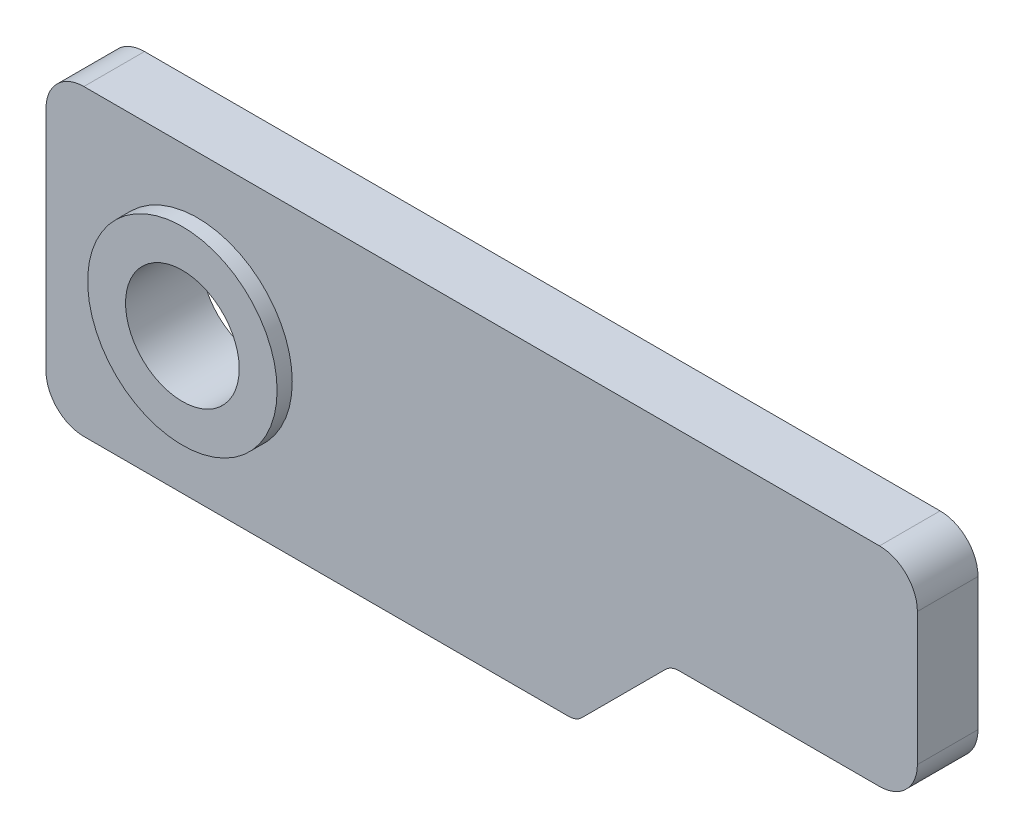
ISO-10303-21;
HEADER;
FILE_DESCRIPTION(('STEP AP214'),'2;1');
FILE_NAME('part.step','',(''),(''),'','','');
FILE_SCHEMA(('AUTOMOTIVE_DESIGN { 1 0 10303 214 1 1 1 1 }'));
ENDSEC;
DATA;
#1=APPLICATION_CONTEXT('core data for automotive mechanical design processes');
#2=APPLICATION_PROTOCOL_DEFINITION('international standard','automotive_design',2000,#1);
#3=PRODUCT_CONTEXT('',#1,'mechanical');
#4=PRODUCT('Part','Part','',(#3));
#5=PRODUCT_RELATED_PRODUCT_CATEGORY('part','',(#4));
#6=PRODUCT_DEFINITION_FORMATION('','',#4);
#7=PRODUCT_DEFINITION_CONTEXT('part definition',#1,'design');
#8=PRODUCT_DEFINITION('design','',#6,#7);
#9=PRODUCT_DEFINITION_SHAPE('','',#8);
#10=(LENGTH_UNIT() NAMED_UNIT(*) SI_UNIT(.MILLI.,.METRE.));
#11=(NAMED_UNIT(*) PLANE_ANGLE_UNIT() SI_UNIT($,.RADIAN.));
#12=(NAMED_UNIT(*) SI_UNIT($,.STERADIAN.) SOLID_ANGLE_UNIT());
#13=UNCERTAINTY_MEASURE_WITH_UNIT(LENGTH_MEASURE(1.E-05),#10,'distance_accuracy_value','');
#14=(GEOMETRIC_REPRESENTATION_CONTEXT(3) GLOBAL_UNCERTAINTY_ASSIGNED_CONTEXT((#13)) GLOBAL_UNIT_ASSIGNED_CONTEXT((#10,
#11,#12)) REPRESENTATION_CONTEXT('',''));
#15=CARTESIAN_POINT('',(0.,0.,0.));
#16=DIRECTION('',(0.,0.,1.));
#17=DIRECTION('',(1.,0.,0.));
#18=AXIS2_PLACEMENT_3D('',#15,#16,#17);
#19=CARTESIAN_POINT('',(12.7071067811865,-2.,0.));
#20=DIRECTION('',(0.,0.,-1.));
#21=DIRECTION('',(-0.382683432365089,0.923879532511287,0.));
#22=AXIS2_PLACEMENT_3D('',#19,#20,#21);
#23=CYLINDRICAL_SURFACE('',#22,0.5);
#24=CARTESIAN_POINT('',(12.7071067811865,-2.,0.));
#25=DIRECTION('',(0.,0.,-1.));
#26=DIRECTION('',(-0.382683432365089,0.923879532511287,0.));
#27=AXIS2_PLACEMENT_3D('',#24,#25,#26);
#28=CIRCLE('',#27,0.5);
#29=CARTESIAN_POINT('',(12.3535533905933,-1.64644660940672,0.));
#30=VERTEX_POINT('',#29);
#31=CARTESIAN_POINT('',(12.7071067811865,-1.5,0.));
#32=VERTEX_POINT('',#31);
#33=EDGE_CURVE('E11',#30,#32,#28,.T.);
#34=ORIENTED_EDGE('',*,*,#33,.T.);
#35=DIRECTION('',(0.,0.,1.));
#36=VECTOR('',#35,1.);
#37=CARTESIAN_POINT('',(12.7071067811865,-1.5,0.));
#38=LINE('',#37,#36);
#39=CARTESIAN_POINT('',(12.7071067811865,-1.5,1.6));
#40=VERTEX_POINT('',#39);
#41=EDGE_CURVE('E27',#32,#40,#38,.T.);
#42=ORIENTED_EDGE('',*,*,#41,.T.);
#43=CARTESIAN_POINT('',(12.7071067811865,-2.,1.6));
#44=DIRECTION('',(0.,0.,1.));
#45=DIRECTION('',(-0.382683432365089,0.923879532511287,0.));
#46=AXIS2_PLACEMENT_3D('',#43,#44,#45);
#47=CIRCLE('',#46,0.5);
#48=CARTESIAN_POINT('',(12.3535533905933,-1.64644660940672,1.6));
#49=VERTEX_POINT('',#48);
#50=EDGE_CURVE('E215',#40,#49,#47,.T.);
#51=ORIENTED_EDGE('',*,*,#50,.T.);
#52=DIRECTION('',(0.,0.,-1.));
#53=VECTOR('',#52,1.);
#54=CARTESIAN_POINT('',(12.3535533905933,-1.64644660940672,0.));
#55=LINE('',#54,#53);
#56=EDGE_CURVE('E208',#49,#30,#55,.T.);
#57=ORIENTED_EDGE('',*,*,#56,.T.);
#58=EDGE_LOOP('',(#34,#42,#51,#57));
#59=FACE_BOUND('',#58,.T.);
#60=ADVANCED_FACE('F17',(#59),#23,.F.);
#61=CARTESIAN_POINT('',(12.5,-1.5,0.));
#62=DIRECTION('',(0.,-1.,0.));
#63=DIRECTION('',(0.707106781186548,0.,0.707106781186548));
#64=AXIS2_PLACEMENT_3D('',#61,#62,#63);
#65=PLANE('',#64);
#66=ORIENTED_EDGE('',*,*,#41,.F.);
#67=DIRECTION('',(-1.,0.,0.));
#68=VECTOR('',#67,1.);
#69=CARTESIAN_POINT('',(19.,-1.5,0.));
#70=LINE('',#69,#68);
#71=CARTESIAN_POINT('',(18.,-1.5,0.));
#72=VERTEX_POINT('',#71);
#73=EDGE_CURVE('E181',#72,#32,#70,.T.);
#74=ORIENTED_EDGE('',*,*,#73,.F.);
#75=DIRECTION('',(0.,0.,-1.));
#76=VECTOR('',#75,1.);
#77=CARTESIAN_POINT('',(18.,-1.5,0.));
#78=LINE('',#77,#76);
#79=CARTESIAN_POINT('',(18.,-1.5,1.6));
#80=VERTEX_POINT('',#79);
#81=EDGE_CURVE('E157',#80,#72,#78,.T.);
#82=ORIENTED_EDGE('',*,*,#81,.F.);
#83=DIRECTION('',(1.,0.,0.));
#84=VECTOR('',#83,1.);
#85=CARTESIAN_POINT('',(19.,-1.5,1.6));
#86=LINE('',#85,#84);
#87=EDGE_CURVE('E163',#40,#80,#86,.T.);
#88=ORIENTED_EDGE('',*,*,#87,.F.);
#89=EDGE_LOOP('',(#66,#74,#82,#88));
#90=FACE_BOUND('',#89,.T.);
#91=ADVANCED_FACE('F221',(#90),#65,.T.);
#92=CARTESIAN_POINT('',(9.79289321881345,-3.5,0.));
#93=DIRECTION('',(0.,0.,1.));
#94=DIRECTION('',(0.382683432365092,-0.923879532511286,0.));
#95=AXIS2_PLACEMENT_3D('',#92,#93,#94);
#96=CYLINDRICAL_SURFACE('',#95,0.5);
#97=CARTESIAN_POINT('',(9.79289321881345,-3.5,1.6));
#98=DIRECTION('',(0.,0.,-1.));
#99=DIRECTION('',(0.382683432365092,-0.923879532511286,0.));
#100=AXIS2_PLACEMENT_3D('',#97,#98,#99);
#101=CIRCLE('',#100,0.5);
#102=CARTESIAN_POINT('',(10.1464466094067,-3.85355339059328,1.6));
#103=VERTEX_POINT('',#102);
#104=CARTESIAN_POINT('',(9.79289321881345,-4.,1.6));
#105=VERTEX_POINT('',#104);
#106=EDGE_CURVE('E205',#103,#105,#101,.T.);
#107=ORIENTED_EDGE('',*,*,#106,.T.);
#108=DIRECTION('',(0.,0.,-1.));
#109=VECTOR('',#108,1.);
#110=CARTESIAN_POINT('',(9.79289321881345,-4.,0.));
#111=LINE('',#110,#109);
#112=CARTESIAN_POINT('',(9.79289321881345,-4.,0.));
#113=VERTEX_POINT('',#112);
#114=EDGE_CURVE('E202',#105,#113,#111,.T.);
#115=ORIENTED_EDGE('',*,*,#114,.T.);
#116=CARTESIAN_POINT('',(9.79289321881345,-3.5,0.));
#117=DIRECTION('',(0.,0.,1.));
#118=DIRECTION('',(0.382683432365092,-0.923879532511286,0.));
#119=AXIS2_PLACEMENT_3D('',#116,#117,#118);
#120=CIRCLE('',#119,0.5);
#121=CARTESIAN_POINT('',(10.1464466094067,-3.85355339059328,0.));
#122=VERTEX_POINT('',#121);
#123=EDGE_CURVE('E199',#113,#122,#120,.T.);
#124=ORIENTED_EDGE('',*,*,#123,.T.);
#125=DIRECTION('',(0.,0.,1.));
#126=VECTOR('',#125,1.);
#127=CARTESIAN_POINT('',(10.1464466094067,-3.85355339059328,0.));
#128=LINE('',#127,#126);
#129=EDGE_CURVE('E193',#122,#103,#128,.T.);
#130=ORIENTED_EDGE('',*,*,#129,.T.);
#131=EDGE_LOOP('',(#107,#115,#124,#130));
#132=FACE_BOUND('',#131,.T.);
#133=ADVANCED_FACE('F265',(#132),#96,.T.);
#134=CARTESIAN_POINT('',(10.,-4.,0.));
#135=DIRECTION('',(0.707106781186547,-0.707106781186548,0.));
#136=DIRECTION('',(0.577350269189626,0.577350269189626,0.577350269189626));
#137=AXIS2_PLACEMENT_3D('',#134,#135,#136);
#138=PLANE('',#137);
#139=ORIENTED_EDGE('',*,*,#56,.F.);
#140=DIRECTION('',(0.707106781186548,0.707106781186547,0.));
#141=VECTOR('',#140,1.);
#142=CARTESIAN_POINT('',(12.5,-1.5,1.6));
#143=LINE('',#142,#141);
#144=EDGE_CURVE('E126',#103,#49,#143,.T.);
#145=ORIENTED_EDGE('',*,*,#144,.F.);
#146=ORIENTED_EDGE('',*,*,#129,.F.);
#147=DIRECTION('',(-0.707106781186548,-0.707106781186547,0.));
#148=VECTOR('',#147,1.);
#149=CARTESIAN_POINT('',(12.5,-1.5,0.));
#150=LINE('',#149,#148);
#151=EDGE_CURVE('E175',#30,#122,#150,.T.);
#152=ORIENTED_EDGE('',*,*,#151,.F.);
#153=EDGE_LOOP('',(#139,#145,#146,#152));
#154=FACE_BOUND('',#153,.T.);
#155=ADVANCED_FACE('F228',(#154),#138,.T.);
#156=CARTESIAN_POINT('',(7.08922064036978,0.386587517259701,0.));
#157=DIRECTION('',(0.,0.,1.));
#158=DIRECTION('',(0.707106781186548,0.707106781186548,0.));
#159=AXIS2_PLACEMENT_3D('',#156,#157,#158);
#160=PLANE('',#159);
#161=ORIENTED_EDGE('',*,*,#123,.F.);
#162=DIRECTION('',(-1.,0.,0.));
#163=VECTOR('',#162,1.);
#164=CARTESIAN_POINT('',(10.,-4.,0.));
#165=LINE('',#164,#163);
#166=CARTESIAN_POINT('',(-3.,-4.,0.));
#167=VERTEX_POINT('',#166);
#168=EDGE_CURVE('E189',#113,#167,#165,.T.);
#169=ORIENTED_EDGE('',*,*,#168,.T.);
#170=CARTESIAN_POINT('',(-3.,-3.,0.));
#171=DIRECTION('',(0.,0.,1.));
#172=DIRECTION('',(-0.707106781186548,-0.707106781186548,0.));
#173=AXIS2_PLACEMENT_3D('',#170,#171,#172);
#174=CIRCLE('',#173,1.);
#175=CARTESIAN_POINT('',(-4.,-3.,0.));
#176=VERTEX_POINT('',#175);
#177=EDGE_CURVE('E145',#176,#167,#174,.T.);
#178=ORIENTED_EDGE('',*,*,#177,.F.);
#179=DIRECTION('',(0.,1.,0.));
#180=VECTOR('',#179,1.);
#181=CARTESIAN_POINT('',(-4.,-4.,0.));
#182=LINE('',#181,#180);
#183=CARTESIAN_POINT('',(-4.,3.,0.));
#184=VERTEX_POINT('',#183);
#185=EDGE_CURVE('E185',#176,#184,#182,.T.);
#186=ORIENTED_EDGE('',*,*,#185,.T.);
#187=CARTESIAN_POINT('',(-3.,3.,0.));
#188=DIRECTION('',(0.,0.,1.));
#189=DIRECTION('',(-0.707106781186548,0.707106781186547,0.));
#190=AXIS2_PLACEMENT_3D('',#187,#188,#189);
#191=CIRCLE('',#190,1.);
#192=CARTESIAN_POINT('',(-3.,4.,0.));
#193=VERTEX_POINT('',#192);
#194=EDGE_CURVE('E123',#193,#184,#191,.T.);
#195=ORIENTED_EDGE('',*,*,#194,.F.);
#196=DIRECTION('',(1.,0.,0.));
#197=VECTOR('',#196,1.);
#198=CARTESIAN_POINT('',(-4.,4.,0.));
#199=LINE('',#198,#197);
#200=CARTESIAN_POINT('',(18.,4.,0.));
#201=VERTEX_POINT('',#200);
#202=EDGE_CURVE('E180',#193,#201,#199,.T.);
#203=ORIENTED_EDGE('',*,*,#202,.T.);
#204=CARTESIAN_POINT('',(18.,3.,0.));
#205=DIRECTION('',(0.,0.,1.));
#206=DIRECTION('',(0.707106781186549,0.707106781186547,0.));
#207=AXIS2_PLACEMENT_3D('',#204,#205,#206);
#208=CIRCLE('',#207,1.);
#209=CARTESIAN_POINT('',(19.,3.,0.));
#210=VERTEX_POINT('',#209);
#211=EDGE_CURVE('E165',#210,#201,#208,.T.);
#212=ORIENTED_EDGE('',*,*,#211,.F.);
#213=DIRECTION('',(0.,-1.,0.));
#214=VECTOR('',#213,1.);
#215=CARTESIAN_POINT('',(19.,4.,0.));
#216=LINE('',#215,#214);
#217=CARTESIAN_POINT('',(19.,-0.5,0.));
#218=VERTEX_POINT('',#217);
#219=EDGE_CURVE('E177',#210,#218,#216,.T.);
#220=ORIENTED_EDGE('',*,*,#219,.T.);
#221=CARTESIAN_POINT('',(18.,-0.5,0.));
#222=DIRECTION('',(0.,0.,1.));
#223=DIRECTION('',(0.707106781186548,-0.707106781186547,0.));
#224=AXIS2_PLACEMENT_3D('',#221,#222,#223);
#225=CIRCLE('',#224,1.);
#226=EDGE_CURVE('E160',#72,#218,#225,.T.);
#227=ORIENTED_EDGE('',*,*,#226,.F.);
#228=ORIENTED_EDGE('',*,*,#73,.T.);
#229=ORIENTED_EDGE('',*,*,#33,.F.);
#230=ORIENTED_EDGE('',*,*,#151,.T.);
#231=EDGE_LOOP('',(#161,#169,#178,#186,#195,#203,#212,#220,#227,#228,#229,#230));
#232=FACE_BOUND('',#231,.T.);
#233=CARTESIAN_POINT('',(0.,0.,0.));
#234=DIRECTION('',(0.,0.,1.));
#235=DIRECTION('',(-1.,0.,0.));
#236=AXIS2_PLACEMENT_3D('',#233,#234,#235);
#237=CIRCLE('',#236,1.5);
#238=CARTESIAN_POINT('',(1.5,0.,0.));
#239=VERTEX_POINT('',#238);
#240=EDGE_CURVE('E172',#239,#239,#237,.T.);
#241=ORIENTED_EDGE('',*,*,#240,.T.);
#242=EDGE_LOOP('',(#241));
#243=FACE_BOUND('',#242,.T.);
#244=ADVANCED_FACE('F231',(#232,#243),#160,.F.);
#245=CARTESIAN_POINT('',(18.,3.,0.));
#246=DIRECTION('',(0.,0.,1.));
#247=DIRECTION('',(0.707106781186549,0.707106781186547,0.));
#248=AXIS2_PLACEMENT_3D('',#245,#246,#247);
#249=CYLINDRICAL_SURFACE('',#248,1.);
#250=CARTESIAN_POINT('',(18.,3.,1.6));
#251=DIRECTION('',(0.,0.,-1.));
#252=DIRECTION('',(0.707106781186549,0.707106781186547,0.));
#253=AXIS2_PLACEMENT_3D('',#250,#251,#252);
#254=CIRCLE('',#253,1.);
#255=CARTESIAN_POINT('',(18.,4.,1.6));
#256=VERTEX_POINT('',#255);
#257=CARTESIAN_POINT('',(19.,3.,1.6));
#258=VERTEX_POINT('',#257);
#259=EDGE_CURVE('E169',#256,#258,#254,.T.);
#260=ORIENTED_EDGE('',*,*,#259,.T.);
#261=DIRECTION('',(0.,0.,-1.));
#262=VECTOR('',#261,1.);
#263=CARTESIAN_POINT('',(19.,3.,0.));
#264=LINE('',#263,#262);
#265=EDGE_CURVE('E166',#258,#210,#264,.T.);
#266=ORIENTED_EDGE('',*,*,#265,.T.);
#267=ORIENTED_EDGE('',*,*,#211,.T.);
#268=DIRECTION('',(0.,0.,1.));
#269=VECTOR('',#268,1.);
#270=CARTESIAN_POINT('',(18.,4.,0.));
#271=LINE('',#270,#269);
#272=EDGE_CURVE('E156',#201,#256,#271,.T.);
#273=ORIENTED_EDGE('',*,*,#272,.T.);
#274=EDGE_LOOP('',(#260,#266,#267,#273));
#275=FACE_BOUND('',#274,.T.);
#276=ADVANCED_FACE('F266',(#275),#249,.T.);
#277=CARTESIAN_POINT('',(19.,-1.5,0.));
#278=DIRECTION('',(1.,0.,0.));
#279=DIRECTION('',(0.,0.707106781186548,0.707106781186548));
#280=AXIS2_PLACEMENT_3D('',#277,#278,#279);
#281=PLANE('',#280);
#282=ORIENTED_EDGE('',*,*,#265,.F.);
#283=DIRECTION('',(0.,1.,0.));
#284=VECTOR('',#283,1.);
#285=CARTESIAN_POINT('',(19.,4.,1.6));
#286=LINE('',#285,#284);
#287=CARTESIAN_POINT('',(19.,-0.5,1.6));
#288=VERTEX_POINT('',#287);
#289=EDGE_CURVE('E133',#288,#258,#286,.T.);
#290=ORIENTED_EDGE('',*,*,#289,.F.);
#291=DIRECTION('',(0.,0.,1.));
#292=VECTOR('',#291,1.);
#293=CARTESIAN_POINT('',(19.,-0.5,0.));
#294=LINE('',#293,#292);
#295=EDGE_CURVE('E152',#218,#288,#294,.T.);
#296=ORIENTED_EDGE('',*,*,#295,.F.);
#297=ORIENTED_EDGE('',*,*,#219,.F.);
#298=EDGE_LOOP('',(#282,#290,#296,#297));
#299=FACE_BOUND('',#298,.T.);
#300=ADVANCED_FACE('F239',(#299),#281,.T.);
#301=CARTESIAN_POINT('',(18.,-0.5,0.));
#302=DIRECTION('',(0.,0.,1.));
#303=DIRECTION('',(0.707106781186548,-0.707106781186547,0.));
#304=AXIS2_PLACEMENT_3D('',#301,#302,#303);
#305=CYLINDRICAL_SURFACE('',#304,1.);
#306=CARTESIAN_POINT('',(18.,-0.5,1.6));
#307=DIRECTION('',(0.,0.,-1.));
#308=DIRECTION('',(0.707106781186548,-0.707106781186547,0.));
#309=AXIS2_PLACEMENT_3D('',#306,#307,#308);
#310=CIRCLE('',#309,1.);
#311=EDGE_CURVE('E153',#288,#80,#310,.T.);
#312=ORIENTED_EDGE('',*,*,#311,.T.);
#313=ORIENTED_EDGE('',*,*,#81,.T.);
#314=ORIENTED_EDGE('',*,*,#226,.T.);
#315=ORIENTED_EDGE('',*,*,#295,.T.);
#316=EDGE_LOOP('',(#312,#313,#314,#315));
#317=FACE_BOUND('',#316,.T.);
#318=ADVANCED_FACE('F237',(#317),#305,.T.);
#319=CARTESIAN_POINT('',(-3.,-3.,0.));
#320=DIRECTION('',(0.,0.,1.));
#321=DIRECTION('',(-0.707106781186548,-0.707106781186548,0.));
#322=AXIS2_PLACEMENT_3D('',#319,#320,#321);
#323=CYLINDRICAL_SURFACE('',#322,1.);
#324=CARTESIAN_POINT('',(-3.,-3.,1.6));
#325=DIRECTION('',(0.,0.,-1.));
#326=DIRECTION('',(-0.707106781186548,-0.707106781186548,0.));
#327=AXIS2_PLACEMENT_3D('',#324,#325,#326);
#328=CIRCLE('',#327,1.);
#329=CARTESIAN_POINT('',(-3.,-4.,1.6));
#330=VERTEX_POINT('',#329);
#331=CARTESIAN_POINT('',(-4.,-3.,1.6));
#332=VERTEX_POINT('',#331);
#333=EDGE_CURVE('E149',#330,#332,#328,.T.);
#334=ORIENTED_EDGE('',*,*,#333,.T.);
#335=DIRECTION('',(0.,0.,-1.));
#336=VECTOR('',#335,1.);
#337=CARTESIAN_POINT('',(-4.,-3.,0.));
#338=LINE('',#337,#336);
#339=EDGE_CURVE('E146',#332,#176,#338,.T.);
#340=ORIENTED_EDGE('',*,*,#339,.T.);
#341=ORIENTED_EDGE('',*,*,#177,.T.);
#342=DIRECTION('',(0.,0.,1.));
#343=VECTOR('',#342,1.);
#344=CARTESIAN_POINT('',(-3.,-4.,0.));
#345=LINE('',#344,#343);
#346=EDGE_CURVE('E141',#167,#330,#345,.T.);
#347=ORIENTED_EDGE('',*,*,#346,.T.);
#348=EDGE_LOOP('',(#334,#340,#341,#347));
#349=FACE_BOUND('',#348,.T.);
#350=ADVANCED_FACE('F258',(#349),#323,.T.);
#351=CARTESIAN_POINT('',(-4.,-4.,0.));
#352=DIRECTION('',(0.,-1.,0.));
#353=DIRECTION('',(0.707106781186548,0.,0.707106781186548));
#354=AXIS2_PLACEMENT_3D('',#351,#352,#353);
#355=PLANE('',#354);
#356=ORIENTED_EDGE('',*,*,#114,.F.);
#357=DIRECTION('',(1.,0.,0.));
#358=VECTOR('',#357,1.);
#359=CARTESIAN_POINT('',(10.,-4.,1.6));
#360=LINE('',#359,#358);
#361=EDGE_CURVE('E129',#330,#105,#360,.T.);
#362=ORIENTED_EDGE('',*,*,#361,.F.);
#363=ORIENTED_EDGE('',*,*,#346,.F.);
#364=ORIENTED_EDGE('',*,*,#168,.F.);
#365=EDGE_LOOP('',(#356,#362,#363,#364));
#366=FACE_BOUND('',#365,.T.);
#367=ADVANCED_FACE('F262',(#366),#355,.T.);
#368=CARTESIAN_POINT('',(-3.,3.,0.));
#369=DIRECTION('',(0.,0.,1.));
#370=DIRECTION('',(-0.707106781186548,0.707106781186547,0.));
#371=AXIS2_PLACEMENT_3D('',#368,#369,#370);
#372=CYLINDRICAL_SURFACE('',#371,1.);
#373=CARTESIAN_POINT('',(-3.,3.,1.6));
#374=DIRECTION('',(0.,0.,-1.));
#375=DIRECTION('',(-0.707106781186548,0.707106781186547,0.));
#376=AXIS2_PLACEMENT_3D('',#373,#374,#375);
#377=CIRCLE('',#376,1.);
#378=CARTESIAN_POINT('',(-4.,3.,1.6));
#379=VERTEX_POINT('',#378);
#380=CARTESIAN_POINT('',(-3.,4.,1.6));
#381=VERTEX_POINT('',#380);
#382=EDGE_CURVE('E138',#379,#381,#377,.T.);
#383=ORIENTED_EDGE('',*,*,#382,.T.);
#384=DIRECTION('',(0.,0.,-1.));
#385=VECTOR('',#384,1.);
#386=CARTESIAN_POINT('',(-3.,4.,0.));
#387=LINE('',#386,#385);
#388=EDGE_CURVE('E135',#381,#193,#387,.T.);
#389=ORIENTED_EDGE('',*,*,#388,.T.);
#390=ORIENTED_EDGE('',*,*,#194,.T.);
#391=DIRECTION('',(0.,0.,1.));
#392=VECTOR('',#391,1.);
#393=CARTESIAN_POINT('',(-4.,3.,0.));
#394=LINE('',#393,#392);
#395=EDGE_CURVE('E121',#184,#379,#394,.T.);
#396=ORIENTED_EDGE('',*,*,#395,.T.);
#397=EDGE_LOOP('',(#383,#389,#390,#396));
#398=FACE_BOUND('',#397,.T.);
#399=ADVANCED_FACE('F249',(#398),#372,.T.);
#400=CARTESIAN_POINT('',(19.,4.,0.));
#401=DIRECTION('',(0.,1.,0.));
#402=DIRECTION('',(0.707106781186548,0.,0.707106781186548));
#403=AXIS2_PLACEMENT_3D('',#400,#401,#402);
#404=PLANE('',#403);
#405=ORIENTED_EDGE('',*,*,#272,.F.);
#406=ORIENTED_EDGE('',*,*,#202,.F.);
#407=ORIENTED_EDGE('',*,*,#388,.F.);
#408=DIRECTION('',(-1.,0.,0.));
#409=VECTOR('',#408,1.);
#410=CARTESIAN_POINT('',(-4.,4.,1.6));
#411=LINE('',#410,#409);
#412=EDGE_CURVE('E131',#256,#381,#411,.T.);
#413=ORIENTED_EDGE('',*,*,#412,.F.);
#414=EDGE_LOOP('',(#405,#406,#407,#413));
#415=FACE_BOUND('',#414,.T.);
#416=ADVANCED_FACE('F246',(#415),#404,.T.);
#417=CARTESIAN_POINT('',(0.,0.,1.6));
#418=DIRECTION('',(0.,0.,1.));
#419=DIRECTION('',(-1.,0.,0.));
#420=AXIS2_PLACEMENT_3D('',#417,#418,#419);
#421=CYLINDRICAL_SURFACE('',#420,2.5);
#422=CARTESIAN_POINT('',(0.,0.,2.));
#423=DIRECTION('',(0.,0.,1.));
#424=DIRECTION('',(-1.,0.,0.));
#425=AXIS2_PLACEMENT_3D('',#422,#423,#424);
#426=CIRCLE('',#425,2.5);
#427=CARTESIAN_POINT('',(2.5,0.,2.));
#428=VERTEX_POINT('',#427);
#429=EDGE_CURVE('E122',#428,#428,#426,.T.);
#430=ORIENTED_EDGE('',*,*,#429,.F.);
#431=EDGE_LOOP('',(#430));
#432=FACE_BOUND('',#431,.T.);
#433=CARTESIAN_POINT('',(0.,0.,1.6));
#434=DIRECTION('',(0.,0.,-1.));
#435=DIRECTION('',(-1.,0.,0.));
#436=AXIS2_PLACEMENT_3D('',#433,#434,#435);
#437=CIRCLE('',#436,2.5);
#438=CARTESIAN_POINT('',(2.5,0.,1.6));
#439=VERTEX_POINT('',#438);
#440=EDGE_CURVE('E113',#439,#439,#437,.T.);
#441=ORIENTED_EDGE('',*,*,#440,.F.);
#442=EDGE_LOOP('',(#441));
#443=FACE_BOUND('',#442,.T.);
#444=ADVANCED_FACE('F360',(#432,#443),#421,.T.);
#445=CARTESIAN_POINT('',(0.,0.,2.));
#446=DIRECTION('',(0.,0.,1.));
#447=DIRECTION('',(0.707106781186548,0.707106781186548,0.));
#448=AXIS2_PLACEMENT_3D('',#445,#446,#447);
#449=PLANE('',#448);
#450=CARTESIAN_POINT('',(0.,0.,2.));
#451=DIRECTION('',(0.,0.,-1.));
#452=DIRECTION('',(-1.,0.,0.));
#453=AXIS2_PLACEMENT_3D('',#450,#451,#452);
#454=CIRCLE('',#453,1.5);
#455=CARTESIAN_POINT('',(1.5,0.,2.));
#456=VERTEX_POINT('',#455);
#457=EDGE_CURVE('E117',#456,#456,#454,.T.);
#458=ORIENTED_EDGE('',*,*,#457,.T.);
#459=EDGE_LOOP('',(#458));
#460=FACE_BOUND('',#459,.T.);
#461=ORIENTED_EDGE('',*,*,#429,.T.);
#462=EDGE_LOOP('',(#461));
#463=FACE_BOUND('',#462,.T.);
#464=ADVANCED_FACE('F370',(#460,#463),#449,.T.);
#465=CARTESIAN_POINT('',(0.,0.,0.));
#466=DIRECTION('',(0.,0.,1.));
#467=DIRECTION('',(-1.,0.,0.));
#468=AXIS2_PLACEMENT_3D('',#465,#466,#467);
#469=CYLINDRICAL_SURFACE('',#468,1.5);
#470=ORIENTED_EDGE('',*,*,#457,.F.);
#471=EDGE_LOOP('',(#470));
#472=FACE_BOUND('',#471,.T.);
#473=ORIENTED_EDGE('',*,*,#240,.F.);
#474=EDGE_LOOP('',(#473));
#475=FACE_BOUND('',#474,.T.);
#476=ADVANCED_FACE('F118',(#472,#475),#469,.F.);
#477=CARTESIAN_POINT('',(-4.,4.,0.));
#478=DIRECTION('',(-1.,0.,0.));
#479=DIRECTION('',(0.,0.707106781186548,0.707106781186548));
#480=AXIS2_PLACEMENT_3D('',#477,#478,#479);
#481=PLANE('',#480);
#482=ORIENTED_EDGE('',*,*,#339,.F.);
#483=DIRECTION('',(0.,-1.,0.));
#484=VECTOR('',#483,1.);
#485=CARTESIAN_POINT('',(-4.,-4.,1.6));
#486=LINE('',#485,#484);
#487=EDGE_CURVE('E21',#379,#332,#486,.T.);
#488=ORIENTED_EDGE('',*,*,#487,.F.);
#489=ORIENTED_EDGE('',*,*,#395,.F.);
#490=ORIENTED_EDGE('',*,*,#185,.F.);
#491=EDGE_LOOP('',(#482,#488,#489,#490));
#492=FACE_BOUND('',#491,.T.);
#493=ADVANCED_FACE('F255',(#492),#481,.T.);
#494=CARTESIAN_POINT('',(7.08922064036978,0.386587517259701,1.6));
#495=DIRECTION('',(0.,0.,1.));
#496=DIRECTION('',(0.707106781186548,0.707106781186548,0.));
#497=AXIS2_PLACEMENT_3D('',#494,#495,#496);
#498=PLANE('',#497);
#499=ORIENTED_EDGE('',*,*,#106,.F.);
#500=ORIENTED_EDGE('',*,*,#144,.T.);
#501=ORIENTED_EDGE('',*,*,#50,.F.);
#502=ORIENTED_EDGE('',*,*,#87,.T.);
#503=ORIENTED_EDGE('',*,*,#311,.F.);
#504=ORIENTED_EDGE('',*,*,#289,.T.);
#505=ORIENTED_EDGE('',*,*,#259,.F.);
#506=ORIENTED_EDGE('',*,*,#412,.T.);
#507=ORIENTED_EDGE('',*,*,#382,.F.);
#508=ORIENTED_EDGE('',*,*,#487,.T.);
#509=ORIENTED_EDGE('',*,*,#333,.F.);
#510=ORIENTED_EDGE('',*,*,#361,.T.);
#511=EDGE_LOOP('',(#499,#500,#501,#502,#503,#504,#505,#506,#507,#508,#509,#510));
#512=FACE_BOUND('',#511,.T.);
#513=ORIENTED_EDGE('',*,*,#440,.T.);
#514=EDGE_LOOP('',(#513));
#515=FACE_BOUND('',#514,.T.);
#516=ADVANCED_FACE('F19',(#512,#515),#498,.T.);
#517=CLOSED_SHELL('',(#60,#91,#133,#155,#244,#276,#300,#318,#350,#367,#399,#416,#444,#464,#476,
#493,#516));
#518=MANIFOLD_SOLID_BREP('B1',#517);
#519=ADVANCED_BREP_SHAPE_REPRESENTATION('',(#18,#518),#14);
#520=SHAPE_DEFINITION_REPRESENTATION(#9,#519);
ENDSEC;
END-ISO-10303-21;
